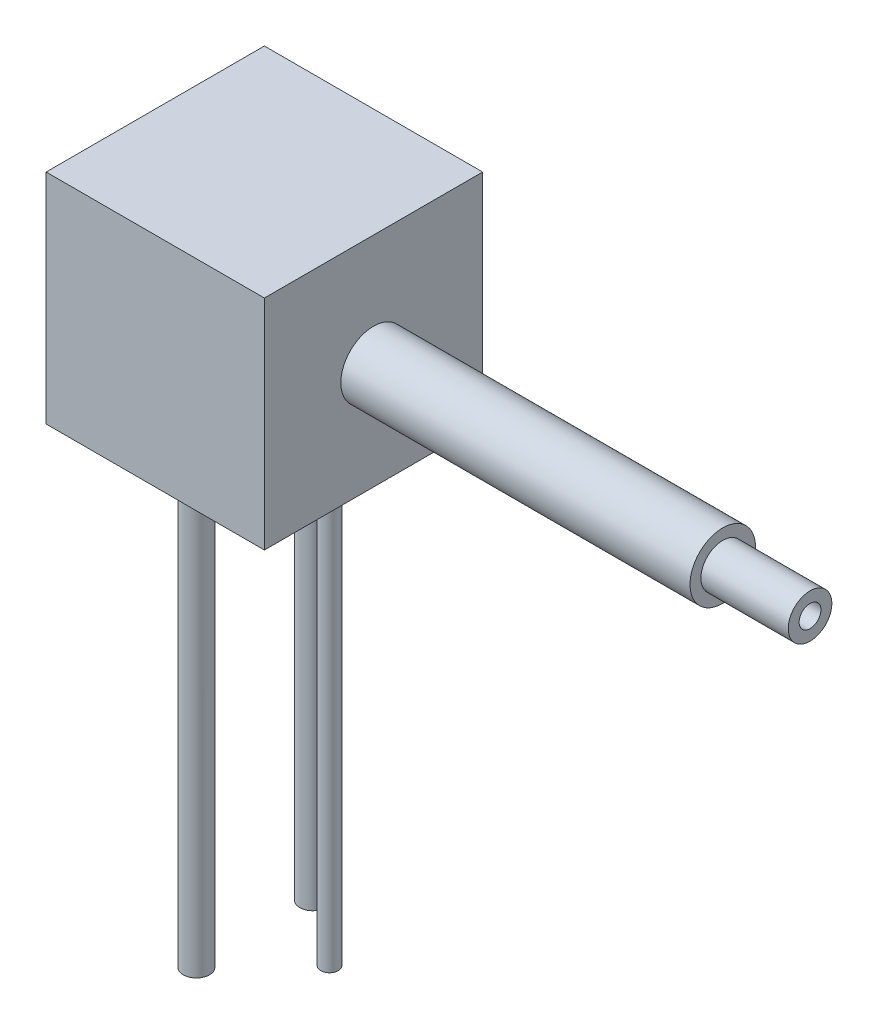
ISO-10303-21;
HEADER;
FILE_DESCRIPTION(('STEP AP214'),'2;1');
FILE_NAME('part.step','',(''),(''),'','','');
FILE_SCHEMA(('AUTOMOTIVE_DESIGN { 1 0 10303 214 1 1 1 1 }'));
ENDSEC;
DATA;
#1=APPLICATION_CONTEXT('core data for automotive mechanical design processes');
#2=APPLICATION_PROTOCOL_DEFINITION('international standard','automotive_design',2000,#1);
#3=PRODUCT_CONTEXT('',#1,'mechanical');
#4=PRODUCT('Part','Part','',(#3));
#5=PRODUCT_RELATED_PRODUCT_CATEGORY('part','',(#4));
#6=PRODUCT_DEFINITION_FORMATION('','',#4);
#7=PRODUCT_DEFINITION_CONTEXT('part definition',#1,'design');
#8=PRODUCT_DEFINITION('design','',#6,#7);
#9=PRODUCT_DEFINITION_SHAPE('','',#8);
#10=(LENGTH_UNIT() NAMED_UNIT(*) SI_UNIT(.MILLI.,.METRE.));
#11=(NAMED_UNIT(*) PLANE_ANGLE_UNIT() SI_UNIT($,.RADIAN.));
#12=(NAMED_UNIT(*) SI_UNIT($,.STERADIAN.) SOLID_ANGLE_UNIT());
#13=UNCERTAINTY_MEASURE_WITH_UNIT(LENGTH_MEASURE(1.E-05),#10,'distance_accuracy_value','');
#14=(GEOMETRIC_REPRESENTATION_CONTEXT(3) GLOBAL_UNCERTAINTY_ASSIGNED_CONTEXT((#13)) GLOBAL_UNIT_ASSIGNED_CONTEXT((#10,
#11,#12)) REPRESENTATION_CONTEXT('',''));
#15=CARTESIAN_POINT('',(0.,0.,0.));
#16=DIRECTION('',(0.,0.,1.));
#17=DIRECTION('',(1.,0.,0.));
#18=AXIS2_PLACEMENT_3D('',#15,#16,#17);
#19=CARTESIAN_POINT('',(250.,500.,-250.));
#20=DIRECTION('',(-1.,0.,0.));
#21=DIRECTION('',(0.,0.,1.));
#22=AXIS2_PLACEMENT_3D('',#19,#20,#21);
#23=PLANE('',#22);
#24=CARTESIAN_POINT('',(250.,244.080255807734,0.));
#25=DIRECTION('',(1.,0.,0.));
#26=DIRECTION('',(0.,0.,-1.));
#27=AXIS2_PLACEMENT_3D('',#24,#25,#26);
#28=CIRCLE('',#27,75.);
#29=CARTESIAN_POINT('',(250.,244.080255807734,-75.0000000000001));
#30=VERTEX_POINT('',#29);
#31=EDGE_CURVE('E42',#30,#30,#28,.T.);
#32=ORIENTED_EDGE('',*,*,#31,.F.);
#33=EDGE_LOOP('',(#32));
#34=FACE_BOUND('',#33,.T.);
#35=DIRECTION('',(0.,0.,-1.));
#36=VECTOR('',#35,1.);
#37=CARTESIAN_POINT('',(250.,0.,-250.));
#38=LINE('',#37,#36);
#39=CARTESIAN_POINT('',(250.,0.,250.));
#40=VERTEX_POINT('',#39);
#41=CARTESIAN_POINT('',(250.,0.,-250.));
#42=VERTEX_POINT('',#41);
#43=EDGE_CURVE('E102',#40,#42,#38,.T.);
#44=ORIENTED_EDGE('',*,*,#43,.T.);
#45=DIRECTION('',(0.,-1.,0.));
#46=VECTOR('',#45,1.);
#47=CARTESIAN_POINT('',(250.,500.,-250.));
#48=LINE('',#47,#46);
#49=CARTESIAN_POINT('',(250.,500.,-250.));
#50=VERTEX_POINT('',#49);
#51=EDGE_CURVE('E93',#50,#42,#48,.T.);
#52=ORIENTED_EDGE('',*,*,#51,.F.);
#53=DIRECTION('',(0.,0.,-1.));
#54=VECTOR('',#53,1.);
#55=CARTESIAN_POINT('',(250.,500.,-250.));
#56=LINE('',#55,#54);
#57=CARTESIAN_POINT('',(250.,500.,250.));
#58=VERTEX_POINT('',#57);
#59=EDGE_CURVE('E87',#58,#50,#56,.T.);
#60=ORIENTED_EDGE('',*,*,#59,.F.);
#61=DIRECTION('',(0.,-1.,0.));
#62=VECTOR('',#61,1.);
#63=CARTESIAN_POINT('',(250.,500.,250.));
#64=LINE('',#63,#62);
#65=EDGE_CURVE('E98',#58,#40,#64,.T.);
#66=ORIENTED_EDGE('',*,*,#65,.T.);
#67=EDGE_LOOP('',(#44,#52,#60,#66));
#68=FACE_BOUND('',#67,.T.);
#69=ADVANCED_FACE('F33',(#34,#68),#23,.F.);
#70=CARTESIAN_POINT('',(-250.,500.,-250.));
#71=DIRECTION('',(0.,0.,1.));
#72=DIRECTION('',(1.,0.,0.));
#73=AXIS2_PLACEMENT_3D('',#70,#71,#72);
#74=PLANE('',#73);
#75=DIRECTION('',(-1.,0.,0.));
#76=VECTOR('',#75,1.);
#77=CARTESIAN_POINT('',(-250.,0.,-250.));
#78=LINE('',#77,#76);
#79=CARTESIAN_POINT('',(-250.,0.,-250.));
#80=VERTEX_POINT('',#79);
#81=EDGE_CURVE('E92',#42,#80,#78,.T.);
#82=ORIENTED_EDGE('',*,*,#81,.T.);
#83=DIRECTION('',(0.,-1.,0.));
#84=VECTOR('',#83,1.);
#85=CARTESIAN_POINT('',(-250.,500.,-250.));
#86=LINE('',#85,#84);
#87=CARTESIAN_POINT('',(-250.,500.,-250.));
#88=VERTEX_POINT('',#87);
#89=EDGE_CURVE('E90',#88,#80,#86,.T.);
#90=ORIENTED_EDGE('',*,*,#89,.F.);
#91=DIRECTION('',(-1.,0.,0.));
#92=VECTOR('',#91,1.);
#93=CARTESIAN_POINT('',(-250.,500.,-250.));
#94=LINE('',#93,#92);
#95=EDGE_CURVE('E82',#50,#88,#94,.T.);
#96=ORIENTED_EDGE('',*,*,#95,.F.);
#97=ORIENTED_EDGE('',*,*,#51,.T.);
#98=EDGE_LOOP('',(#82,#90,#96,#97));
#99=FACE_BOUND('',#98,.T.);
#100=ADVANCED_FACE('F91',(#99),#74,.F.);
#101=CARTESIAN_POINT('',(-250.,500.,-250.));
#102=DIRECTION('',(1.,0.,0.));
#103=DIRECTION('',(0.,0.,-1.));
#104=AXIS2_PLACEMENT_3D('',#101,#102,#103);
#105=PLANE('',#104);
#106=DIRECTION('',(0.,0.,1.));
#107=VECTOR('',#106,1.);
#108=CARTESIAN_POINT('',(-250.,0.,-250.));
#109=LINE('',#108,#107);
#110=CARTESIAN_POINT('',(-250.,0.,250.));
#111=VERTEX_POINT('',#110);
#112=EDGE_CURVE('E68',#80,#111,#109,.T.);
#113=ORIENTED_EDGE('',*,*,#112,.T.);
#114=DIRECTION('',(0.,-1.,0.));
#115=VECTOR('',#114,1.);
#116=CARTESIAN_POINT('',(-250.,500.,250.));
#117=LINE('',#116,#115);
#118=CARTESIAN_POINT('',(-250.,500.,250.));
#119=VERTEX_POINT('',#118);
#120=EDGE_CURVE('E94',#119,#111,#117,.T.);
#121=ORIENTED_EDGE('',*,*,#120,.F.);
#122=DIRECTION('',(0.,0.,1.));
#123=VECTOR('',#122,1.);
#124=CARTESIAN_POINT('',(-250.,500.,-250.));
#125=LINE('',#124,#123);
#126=EDGE_CURVE('E85',#88,#119,#125,.T.);
#127=ORIENTED_EDGE('',*,*,#126,.F.);
#128=ORIENTED_EDGE('',*,*,#89,.T.);
#129=EDGE_LOOP('',(#113,#121,#127,#128));
#130=FACE_BOUND('',#129,.T.);
#131=ADVANCED_FACE('F96',(#130),#105,.F.);
#132=CARTESIAN_POINT('',(-250.,500.,250.));
#133=DIRECTION('',(0.,0.,-1.));
#134=DIRECTION('',(-1.,0.,0.));
#135=AXIS2_PLACEMENT_3D('',#132,#133,#134);
#136=PLANE('',#135);
#137=DIRECTION('',(1.,0.,0.));
#138=VECTOR('',#137,1.);
#139=CARTESIAN_POINT('',(-250.,0.,250.));
#140=LINE('',#139,#138);
#141=EDGE_CURVE('E74',#111,#40,#140,.T.);
#142=ORIENTED_EDGE('',*,*,#141,.T.);
#143=ORIENTED_EDGE('',*,*,#65,.F.);
#144=DIRECTION('',(1.,0.,0.));
#145=VECTOR('',#144,1.);
#146=CARTESIAN_POINT('',(-250.,500.,250.));
#147=LINE('',#146,#145);
#148=EDGE_CURVE('E51',#119,#58,#147,.T.);
#149=ORIENTED_EDGE('',*,*,#148,.F.);
#150=ORIENTED_EDGE('',*,*,#120,.T.);
#151=EDGE_LOOP('',(#142,#143,#149,#150));
#152=FACE_BOUND('',#151,.T.);
#153=ADVANCED_FACE('F158',(#152),#136,.F.);
#154=CARTESIAN_POINT('',(0.,500.,0.));
#155=DIRECTION('',(0.,1.,0.));
#156=DIRECTION('',(0.,0.,1.));
#157=AXIS2_PLACEMENT_3D('',#154,#155,#156);
#158=PLANE('',#157);
#159=ORIENTED_EDGE('',*,*,#59,.T.);
#160=ORIENTED_EDGE('',*,*,#95,.T.);
#161=ORIENTED_EDGE('',*,*,#126,.T.);
#162=ORIENTED_EDGE('',*,*,#148,.T.);
#163=EDGE_LOOP('',(#159,#160,#161,#162));
#164=FACE_BOUND('',#163,.T.);
#165=ADVANCED_FACE('F83',(#164),#158,.T.);
#166=CARTESIAN_POINT('',(0.,0.,0.));
#167=DIRECTION('',(0.,1.,0.));
#168=DIRECTION('',(0.,0.,1.));
#169=AXIS2_PLACEMENT_3D('',#166,#167,#168);
#170=PLANE('',#169);
#171=CARTESIAN_POINT('',(0.,0.,-111.056313587958));
#172=DIRECTION('',(0.,1.,0.));
#173=DIRECTION('',(0.,0.,1.));
#174=AXIS2_PLACEMENT_3D('',#171,#172,#173);
#175=CIRCLE('',#174,30.);
#176=CARTESIAN_POINT('',(0.,0.,-81.0563135879577));
#177=VERTEX_POINT('',#176);
#178=EDGE_CURVE('E36',#177,#177,#175,.F.);
#179=ORIENTED_EDGE('',*,*,#178,.F.);
#180=EDGE_LOOP('',(#179));
#181=FACE_BOUND('',#180,.T.);
#182=CARTESIAN_POINT('',(149.221176771437,0.,0.));
#183=DIRECTION('',(0.,1.,0.));
#184=DIRECTION('',(0.,0.,1.));
#185=AXIS2_PLACEMENT_3D('',#182,#183,#184);
#186=CIRCLE('',#185,20.);
#187=CARTESIAN_POINT('',(149.221176771437,0.,20.));
#188=VERTEX_POINT('',#187);
#189=EDGE_CURVE('E117',#188,#188,#186,.F.);
#190=ORIENTED_EDGE('',*,*,#189,.F.);
#191=EDGE_LOOP('',(#190));
#192=FACE_BOUND('',#191,.T.);
#193=CARTESIAN_POINT('',(-149.221176771437,0.,0.));
#194=DIRECTION('',(0.,1.,0.));
#195=DIRECTION('',(0.,0.,1.));
#196=AXIS2_PLACEMENT_3D('',#193,#194,#195);
#197=CIRCLE('',#196,20.);
#198=CARTESIAN_POINT('',(-149.221176771437,0.,20.));
#199=VERTEX_POINT('',#198);
#200=EDGE_CURVE('E115',#199,#199,#197,.F.);
#201=ORIENTED_EDGE('',*,*,#200,.F.);
#202=EDGE_LOOP('',(#201));
#203=FACE_BOUND('',#202,.T.);
#204=CARTESIAN_POINT('',(0.,0.,155.753901100142));
#205=DIRECTION('',(0.,1.,0.));
#206=DIRECTION('',(0.,0.,1.));
#207=AXIS2_PLACEMENT_3D('',#204,#205,#206);
#208=CIRCLE('',#207,30.);
#209=CARTESIAN_POINT('',(0.,0.,185.753901100142));
#210=VERTEX_POINT('',#209);
#211=EDGE_CURVE('E112',#210,#210,#208,.F.);
#212=ORIENTED_EDGE('',*,*,#211,.F.);
#213=EDGE_LOOP('',(#212));
#214=FACE_BOUND('',#213,.T.);
#215=ORIENTED_EDGE('',*,*,#43,.F.);
#216=ORIENTED_EDGE('',*,*,#141,.F.);
#217=ORIENTED_EDGE('',*,*,#112,.F.);
#218=ORIENTED_EDGE('',*,*,#81,.F.);
#219=EDGE_LOOP('',(#215,#216,#217,#218));
#220=FACE_BOUND('',#219,.T.);
#221=ADVANCED_FACE('F148',(#181,#192,#203,#214,#220),#170,.F.);
#222=CARTESIAN_POINT('',(0.,-1000.,155.753901100142));
#223=DIRECTION('',(0.,1.,0.));
#224=DIRECTION('',(0.,0.,1.));
#225=AXIS2_PLACEMENT_3D('',#222,#223,#224);
#226=CYLINDRICAL_SURFACE('',#225,30.);
#227=CARTESIAN_POINT('',(0.,-1000.,155.753901100142));
#228=DIRECTION('',(0.,-1.,0.));
#229=DIRECTION('',(0.,0.,-1.));
#230=AXIS2_PLACEMENT_3D('',#227,#228,#229);
#231=CIRCLE('',#230,30.);
#232=CARTESIAN_POINT('',(0.,-1000.,125.753901100142));
#233=VERTEX_POINT('',#232);
#234=EDGE_CURVE('E105',#233,#233,#231,.T.);
#235=ORIENTED_EDGE('',*,*,#234,.F.);
#236=EDGE_LOOP('',(#235));
#237=FACE_BOUND('',#236,.T.);
#238=ORIENTED_EDGE('',*,*,#211,.T.);
#239=EDGE_LOOP('',(#238));
#240=FACE_BOUND('',#239,.T.);
#241=ADVANCED_FACE('F145',(#237,#240),#226,.T.);
#242=CARTESIAN_POINT('',(0.,-1000.,155.753901100142));
#243=DIRECTION('',(0.,-1.,0.));
#244=DIRECTION('',(0.,0.,-1.));
#245=AXIS2_PLACEMENT_3D('',#242,#243,#244);
#246=PLANE('',#245);
#247=CARTESIAN_POINT('',(0.,-1000.,155.753901100142));
#248=DIRECTION('',(0.,-1.,0.));
#249=DIRECTION('',(0.,0.,-1.));
#250=AXIS2_PLACEMENT_3D('',#247,#248,#249);
#251=CIRCLE('',#250,15.);
#252=CARTESIAN_POINT('',(0.,-1000.,140.753901100142));
#253=VERTEX_POINT('',#252);
#254=EDGE_CURVE('E421',#253,#253,#251,.T.);
#255=ORIENTED_EDGE('',*,*,#254,.F.);
#256=EDGE_LOOP('',(#255));
#257=FACE_BOUND('',#256,.T.);
#258=ORIENTED_EDGE('',*,*,#234,.T.);
#259=EDGE_LOOP('',(#258));
#260=FACE_BOUND('',#259,.T.);
#261=ADVANCED_FACE('F143',(#257,#260),#246,.T.);
#262=CARTESIAN_POINT('',(-149.221176771437,-1000.,0.));
#263=DIRECTION('',(0.,1.,0.));
#264=DIRECTION('',(0.,0.,1.));
#265=AXIS2_PLACEMENT_3D('',#262,#263,#264);
#266=CYLINDRICAL_SURFACE('',#265,20.);
#267=CARTESIAN_POINT('',(-149.221176771437,-1000.,0.));
#268=DIRECTION('',(0.,-1.,0.));
#269=DIRECTION('',(0.,0.,-1.));
#270=AXIS2_PLACEMENT_3D('',#267,#268,#269);
#271=CIRCLE('',#270,20.);
#272=CARTESIAN_POINT('',(-149.221176771437,-1000.,-20.));
#273=VERTEX_POINT('',#272);
#274=EDGE_CURVE('E137',#273,#273,#271,.T.);
#275=ORIENTED_EDGE('',*,*,#274,.F.);
#276=EDGE_LOOP('',(#275));
#277=FACE_BOUND('',#276,.T.);
#278=ORIENTED_EDGE('',*,*,#200,.T.);
#279=EDGE_LOOP('',(#278));
#280=FACE_BOUND('',#279,.T.);
#281=ADVANCED_FACE('F207',(#277,#280),#266,.T.);
#282=CARTESIAN_POINT('',(-149.221176771437,-1000.,0.));
#283=DIRECTION('',(0.,-1.,0.));
#284=DIRECTION('',(0.,0.,-1.));
#285=AXIS2_PLACEMENT_3D('',#282,#283,#284);
#286=PLANE('',#285);
#287=CARTESIAN_POINT('',(-149.221176771437,-1000.,0.));
#288=DIRECTION('',(0.,-1.,0.));
#289=DIRECTION('',(0.,0.,-1.));
#290=AXIS2_PLACEMENT_3D('',#287,#288,#289);
#291=CIRCLE('',#290,10.);
#292=CARTESIAN_POINT('',(-149.221176771437,-1000.,-10.));
#293=VERTEX_POINT('',#292);
#294=EDGE_CURVE('E444',#293,#293,#291,.T.);
#295=ORIENTED_EDGE('',*,*,#294,.F.);
#296=EDGE_LOOP('',(#295));
#297=FACE_BOUND('',#296,.T.);
#298=ORIENTED_EDGE('',*,*,#274,.T.);
#299=EDGE_LOOP('',(#298));
#300=FACE_BOUND('',#299,.T.);
#301=ADVANCED_FACE('F212',(#297,#300),#286,.T.);
#302=CARTESIAN_POINT('',(149.221176771437,-1000.,0.));
#303=DIRECTION('',(0.,1.,0.));
#304=DIRECTION('',(0.,0.,1.));
#305=AXIS2_PLACEMENT_3D('',#302,#303,#304);
#306=CYLINDRICAL_SURFACE('',#305,20.);
#307=CARTESIAN_POINT('',(149.221176771437,-1000.,0.));
#308=DIRECTION('',(0.,-1.,0.));
#309=DIRECTION('',(0.,0.,-1.));
#310=AXIS2_PLACEMENT_3D('',#307,#308,#309);
#311=CIRCLE('',#310,20.);
#312=CARTESIAN_POINT('',(149.221176771437,-1000.,-20.));
#313=VERTEX_POINT('',#312);
#314=EDGE_CURVE('E134',#313,#313,#311,.T.);
#315=ORIENTED_EDGE('',*,*,#314,.F.);
#316=EDGE_LOOP('',(#315));
#317=FACE_BOUND('',#316,.T.);
#318=ORIENTED_EDGE('',*,*,#189,.T.);
#319=EDGE_LOOP('',(#318));
#320=FACE_BOUND('',#319,.T.);
#321=ADVANCED_FACE('F220',(#317,#320),#306,.T.);
#322=CARTESIAN_POINT('',(149.221176771437,-1000.,0.));
#323=DIRECTION('',(0.,-1.,0.));
#324=DIRECTION('',(0.,0.,-1.));
#325=AXIS2_PLACEMENT_3D('',#322,#323,#324);
#326=PLANE('',#325);
#327=CARTESIAN_POINT('',(149.221176771437,-1000.,0.));
#328=DIRECTION('',(0.,-1.,0.));
#329=DIRECTION('',(0.,0.,-1.));
#330=AXIS2_PLACEMENT_3D('',#327,#328,#329);
#331=CIRCLE('',#330,10.);
#332=CARTESIAN_POINT('',(149.221176771437,-1000.,-10.));
#333=VERTEX_POINT('',#332);
#334=EDGE_CURVE('E432',#333,#333,#331,.T.);
#335=ORIENTED_EDGE('',*,*,#334,.F.);
#336=EDGE_LOOP('',(#335));
#337=FACE_BOUND('',#336,.T.);
#338=ORIENTED_EDGE('',*,*,#314,.T.);
#339=EDGE_LOOP('',(#338));
#340=FACE_BOUND('',#339,.T.);
#341=ADVANCED_FACE('F225',(#337,#340),#326,.T.);
#342=CARTESIAN_POINT('',(0.,-1000.,-111.056313587958));
#343=DIRECTION('',(0.,1.,0.));
#344=DIRECTION('',(0.,0.,1.));
#345=AXIS2_PLACEMENT_3D('',#342,#343,#344);
#346=CYLINDRICAL_SURFACE('',#345,30.);
#347=CARTESIAN_POINT('',(0.,-1000.,-111.056313587958));
#348=DIRECTION('',(0.,-1.,0.));
#349=DIRECTION('',(0.,0.,-1.));
#350=AXIS2_PLACEMENT_3D('',#347,#348,#349);
#351=CIRCLE('',#350,30.);
#352=CARTESIAN_POINT('',(0.,-1000.,-141.056313587958));
#353=VERTEX_POINT('',#352);
#354=EDGE_CURVE('E131',#353,#353,#351,.T.);
#355=ORIENTED_EDGE('',*,*,#354,.F.);
#356=EDGE_LOOP('',(#355));
#357=FACE_BOUND('',#356,.T.);
#358=ORIENTED_EDGE('',*,*,#178,.T.);
#359=EDGE_LOOP('',(#358));
#360=FACE_BOUND('',#359,.T.);
#361=ADVANCED_FACE('F233',(#357,#360),#346,.T.);
#362=CARTESIAN_POINT('',(0.,-1000.,-111.056313587958));
#363=DIRECTION('',(0.,-1.,0.));
#364=DIRECTION('',(0.,0.,-1.));
#365=AXIS2_PLACEMENT_3D('',#362,#363,#364);
#366=PLANE('',#365);
#367=CARTESIAN_POINT('',(0.,-1000.,-111.056313587958));
#368=DIRECTION('',(0.,-1.,0.));
#369=DIRECTION('',(0.,0.,-1.));
#370=AXIS2_PLACEMENT_3D('',#367,#368,#369);
#371=CIRCLE('',#370,15.);
#372=CARTESIAN_POINT('',(0.,-1000.,-126.056313587958));
#373=VERTEX_POINT('',#372);
#374=EDGE_CURVE('E438',#373,#373,#371,.T.);
#375=ORIENTED_EDGE('',*,*,#374,.F.);
#376=EDGE_LOOP('',(#375));
#377=FACE_BOUND('',#376,.T.);
#378=ORIENTED_EDGE('',*,*,#354,.T.);
#379=EDGE_LOOP('',(#378));
#380=FACE_BOUND('',#379,.T.);
#381=ADVANCED_FACE('F237',(#377,#380),#366,.T.);
#382=CARTESIAN_POINT('',(1050.,244.080255807734,-2.33146835171283E-13));
#383=DIRECTION('',(-1.,0.,0.));
#384=DIRECTION('',(0.,0.,1.));
#385=AXIS2_PLACEMENT_3D('',#382,#383,#384);
#386=CYLINDRICAL_SURFACE('',#385,75.);
#387=CARTESIAN_POINT('',(1050.,244.080255807734,-2.33146835171283E-13));
#388=DIRECTION('',(1.,0.,0.));
#389=DIRECTION('',(0.,0.,-1.));
#390=AXIS2_PLACEMENT_3D('',#387,#388,#389);
#391=CIRCLE('',#390,75.);
#392=CARTESIAN_POINT('',(1050.,244.080255807734,-75.0000000000002));
#393=VERTEX_POINT('',#392);
#394=EDGE_CURVE('E130',#393,#393,#391,.T.);
#395=ORIENTED_EDGE('',*,*,#394,.F.);
#396=EDGE_LOOP('',(#395));
#397=FACE_BOUND('',#396,.T.);
#398=ORIENTED_EDGE('',*,*,#31,.T.);
#399=EDGE_LOOP('',(#398));
#400=FACE_BOUND('',#399,.T.);
#401=ADVANCED_FACE('F250',(#397,#400),#386,.T.);
#402=CARTESIAN_POINT('',(1050.,244.080255807734,-2.33146835171283E-13));
#403=DIRECTION('',(1.,0.,0.));
#404=DIRECTION('',(0.,0.,-1.));
#405=AXIS2_PLACEMENT_3D('',#402,#403,#404);
#406=PLANE('',#405);
#407=CARTESIAN_POINT('',(1050.,244.080255807734,-2.33146835171283E-13));
#408=DIRECTION('',(1.,0.,0.));
#409=DIRECTION('',(0.,0.,-1.));
#410=AXIS2_PLACEMENT_3D('',#407,#408,#409);
#411=CIRCLE('',#410,50.);
#412=CARTESIAN_POINT('',(1050.,244.080255807734,-50.0000000000003));
#413=VERTEX_POINT('',#412);
#414=EDGE_CURVE('E11',#413,#413,#411,.T.);
#415=ORIENTED_EDGE('',*,*,#414,.F.);
#416=EDGE_LOOP('',(#415));
#417=FACE_BOUND('',#416,.T.);
#418=ORIENTED_EDGE('',*,*,#394,.T.);
#419=EDGE_LOOP('',(#418));
#420=FACE_BOUND('',#419,.T.);
#421=ADVANCED_FACE('F255',(#417,#420),#406,.T.);
#422=CARTESIAN_POINT('',(1250.,244.080255807734,-2.77555756156289E-13));
#423=DIRECTION('',(-1.,0.,0.));
#424=DIRECTION('',(0.,0.,1.));
#425=AXIS2_PLACEMENT_3D('',#422,#423,#424);
#426=CYLINDRICAL_SURFACE('',#425,50.);
#427=CARTESIAN_POINT('',(1250.,244.080255807734,-2.77555756156289E-13));
#428=DIRECTION('',(1.,0.,0.));
#429=DIRECTION('',(0.,0.,-1.));
#430=AXIS2_PLACEMENT_3D('',#427,#428,#429);
#431=CIRCLE('',#430,50.);
#432=CARTESIAN_POINT('',(1250.,244.080255807734,-50.0000000000003));
#433=VERTEX_POINT('',#432);
#434=EDGE_CURVE('E448',#433,#433,#431,.T.);
#435=ORIENTED_EDGE('',*,*,#434,.F.);
#436=EDGE_LOOP('',(#435));
#437=FACE_BOUND('',#436,.T.);
#438=ORIENTED_EDGE('',*,*,#414,.T.);
#439=EDGE_LOOP('',(#438));
#440=FACE_BOUND('',#439,.T.);
#441=ADVANCED_FACE('F265',(#437,#440),#426,.T.);
#442=CARTESIAN_POINT('',(1250.,244.080255807734,-2.77555756156289E-13));
#443=DIRECTION('',(1.,0.,0.));
#444=DIRECTION('',(0.,0.,-1.));
#445=AXIS2_PLACEMENT_3D('',#442,#443,#444);
#446=PLANE('',#445);
#447=CARTESIAN_POINT('',(1250.,244.080255807734,-2.77555756156289E-13));
#448=DIRECTION('',(1.,0.,0.));
#449=DIRECTION('',(0.,0.,-1.));
#450=AXIS2_PLACEMENT_3D('',#447,#448,#449);
#451=CIRCLE('',#450,25.);
#452=CARTESIAN_POINT('',(1250.,244.080255807734,-25.0000000000003));
#453=VERTEX_POINT('',#452);
#454=EDGE_CURVE('E420',#453,#453,#451,.T.);
#455=ORIENTED_EDGE('',*,*,#454,.F.);
#456=EDGE_LOOP('',(#455));
#457=FACE_BOUND('',#456,.T.);
#458=ORIENTED_EDGE('',*,*,#434,.T.);
#459=EDGE_LOOP('',(#458));
#460=FACE_BOUND('',#459,.T.);
#461=ADVANCED_FACE('F275',(#457,#460),#446,.T.);
#462=CARTESIAN_POINT('',(50.,244.080255807734,0.));
#463=DIRECTION('',(1.,0.,0.));
#464=DIRECTION('',(0.,0.,-1.));
#465=AXIS2_PLACEMENT_3D('',#462,#463,#464);
#466=CYLINDRICAL_SURFACE('',#465,25.);
#467=CARTESIAN_POINT('',(50.,244.080255807734,0.));
#468=DIRECTION('',(1.,0.,0.));
#469=DIRECTION('',(0.,0.,-1.));
#470=AXIS2_PLACEMENT_3D('',#467,#468,#469);
#471=CIRCLE('',#470,25.);
#472=CARTESIAN_POINT('',(50.,244.080255807734,-25.));
#473=VERTEX_POINT('',#472);
#474=EDGE_CURVE('E424',#473,#473,#471,.T.);
#475=ORIENTED_EDGE('',*,*,#474,.F.);
#476=EDGE_LOOP('',(#475));
#477=FACE_BOUND('',#476,.T.);
#478=ORIENTED_EDGE('',*,*,#454,.T.);
#479=EDGE_LOOP('',(#478));
#480=FACE_BOUND('',#479,.T.);
#481=ADVANCED_FACE('F285',(#477,#480),#466,.F.);
#482=CARTESIAN_POINT('',(50.,244.080255807734,0.));
#483=DIRECTION('',(1.,0.,0.));
#484=DIRECTION('',(0.,0.,-1.));
#485=AXIS2_PLACEMENT_3D('',#482,#483,#484);
#486=PLANE('',#485);
#487=ORIENTED_EDGE('',*,*,#474,.T.);
#488=EDGE_LOOP('',(#487));
#489=FACE_BOUND('',#488,.T.);
#490=ADVANCED_FACE('F295',(#489),#486,.T.);
#491=CARTESIAN_POINT('',(0.,-800.,-111.056313587958));
#492=DIRECTION('',(0.,-1.,0.));
#493=DIRECTION('',(0.,0.,-1.));
#494=AXIS2_PLACEMENT_3D('',#491,#492,#493);
#495=CYLINDRICAL_SURFACE('',#494,15.);
#496=CARTESIAN_POINT('',(0.,-800.,-111.056313587958));
#497=DIRECTION('',(0.,-1.,0.));
#498=DIRECTION('',(0.,0.,-1.));
#499=AXIS2_PLACEMENT_3D('',#496,#497,#498);
#500=CIRCLE('',#499,15.);
#501=CARTESIAN_POINT('',(0.,-800.,-126.056313587958));
#502=VERTEX_POINT('',#501);
#503=EDGE_CURVE('E435',#502,#502,#500,.T.);
#504=ORIENTED_EDGE('',*,*,#503,.F.);
#505=EDGE_LOOP('',(#504));
#506=FACE_BOUND('',#505,.T.);
#507=ORIENTED_EDGE('',*,*,#374,.T.);
#508=EDGE_LOOP('',(#507));
#509=FACE_BOUND('',#508,.T.);
#510=ADVANCED_FACE('F305',(#506,#509),#495,.F.);
#511=CARTESIAN_POINT('',(0.,-800.,-111.056313587958));
#512=DIRECTION('',(0.,-1.,0.));
#513=DIRECTION('',(0.,0.,-1.));
#514=AXIS2_PLACEMENT_3D('',#511,#512,#513);
#515=PLANE('',#514);
#516=ORIENTED_EDGE('',*,*,#503,.T.);
#517=EDGE_LOOP('',(#516));
#518=FACE_BOUND('',#517,.T.);
#519=ADVANCED_FACE('F343',(#518),#515,.T.);
#520=CARTESIAN_POINT('',(149.221176771437,-800.,0.));
#521=DIRECTION('',(0.,-1.,0.));
#522=DIRECTION('',(0.,0.,-1.));
#523=AXIS2_PLACEMENT_3D('',#520,#521,#522);
#524=CYLINDRICAL_SURFACE('',#523,10.);
#525=CARTESIAN_POINT('',(149.221176771437,-800.,0.));
#526=DIRECTION('',(0.,-1.,0.));
#527=DIRECTION('',(0.,0.,-1.));
#528=AXIS2_PLACEMENT_3D('',#525,#526,#527);
#529=CIRCLE('',#528,10.);
#530=CARTESIAN_POINT('',(149.221176771437,-800.,-10.));
#531=VERTEX_POINT('',#530);
#532=EDGE_CURVE('E427',#531,#531,#529,.T.);
#533=ORIENTED_EDGE('',*,*,#532,.F.);
#534=EDGE_LOOP('',(#533));
#535=FACE_BOUND('',#534,.T.);
#536=ORIENTED_EDGE('',*,*,#334,.T.);
#537=EDGE_LOOP('',(#536));
#538=FACE_BOUND('',#537,.T.);
#539=ADVANCED_FACE('F353',(#535,#538),#524,.F.);
#540=CARTESIAN_POINT('',(149.221176771437,-800.,0.));
#541=DIRECTION('',(0.,-1.,0.));
#542=DIRECTION('',(0.,0.,-1.));
#543=AXIS2_PLACEMENT_3D('',#540,#541,#542);
#544=PLANE('',#543);
#545=ORIENTED_EDGE('',*,*,#532,.T.);
#546=EDGE_LOOP('',(#545));
#547=FACE_BOUND('',#546,.T.);
#548=ADVANCED_FACE('F363',(#547),#544,.T.);
#549=CARTESIAN_POINT('',(-149.221176771437,-800.,0.));
#550=DIRECTION('',(0.,-1.,0.));
#551=DIRECTION('',(0.,0.,-1.));
#552=AXIS2_PLACEMENT_3D('',#549,#550,#551);
#553=CYLINDRICAL_SURFACE('',#552,10.);
#554=CARTESIAN_POINT('',(-149.221176771437,-800.,0.));
#555=DIRECTION('',(0.,-1.,0.));
#556=DIRECTION('',(0.,0.,-1.));
#557=AXIS2_PLACEMENT_3D('',#554,#555,#556);
#558=CIRCLE('',#557,10.);
#559=CARTESIAN_POINT('',(-149.221176771437,-800.,-10.));
#560=VERTEX_POINT('',#559);
#561=EDGE_CURVE('E441',#560,#560,#558,.T.);
#562=ORIENTED_EDGE('',*,*,#561,.F.);
#563=EDGE_LOOP('',(#562));
#564=FACE_BOUND('',#563,.T.);
#565=ORIENTED_EDGE('',*,*,#294,.T.);
#566=EDGE_LOOP('',(#565));
#567=FACE_BOUND('',#566,.T.);
#568=ADVANCED_FACE('F373',(#564,#567),#553,.F.);
#569=CARTESIAN_POINT('',(-149.221176771437,-800.,0.));
#570=DIRECTION('',(0.,-1.,0.));
#571=DIRECTION('',(0.,0.,-1.));
#572=AXIS2_PLACEMENT_3D('',#569,#570,#571);
#573=PLANE('',#572);
#574=ORIENTED_EDGE('',*,*,#561,.T.);
#575=EDGE_LOOP('',(#574));
#576=FACE_BOUND('',#575,.T.);
#577=ADVANCED_FACE('F383',(#576),#573,.T.);
#578=CARTESIAN_POINT('',(0.,-800.,155.753901100142));
#579=DIRECTION('',(0.,-1.,0.));
#580=DIRECTION('',(0.,0.,-1.));
#581=AXIS2_PLACEMENT_3D('',#578,#579,#580);
#582=CYLINDRICAL_SURFACE('',#581,15.);
#583=CARTESIAN_POINT('',(0.,-800.,155.753901100142));
#584=DIRECTION('',(0.,-1.,0.));
#585=DIRECTION('',(0.,0.,-1.));
#586=AXIS2_PLACEMENT_3D('',#583,#584,#585);
#587=CIRCLE('',#586,15.);
#588=CARTESIAN_POINT('',(0.,-800.,140.753901100142));
#589=VERTEX_POINT('',#588);
#590=EDGE_CURVE('E419',#589,#589,#587,.T.);
#591=ORIENTED_EDGE('',*,*,#590,.F.);
#592=EDGE_LOOP('',(#591));
#593=FACE_BOUND('',#592,.T.);
#594=ORIENTED_EDGE('',*,*,#254,.T.);
#595=EDGE_LOOP('',(#594));
#596=FACE_BOUND('',#595,.T.);
#597=ADVANCED_FACE('F393',(#593,#596),#582,.F.);
#598=CARTESIAN_POINT('',(0.,-800.,155.753901100142));
#599=DIRECTION('',(0.,-1.,0.));
#600=DIRECTION('',(0.,0.,-1.));
#601=AXIS2_PLACEMENT_3D('',#598,#599,#600);
#602=PLANE('',#601);
#603=ORIENTED_EDGE('',*,*,#590,.T.);
#604=EDGE_LOOP('',(#603));
#605=FACE_BOUND('',#604,.T.);
#606=ADVANCED_FACE('F403',(#605),#602,.T.);
#607=CLOSED_SHELL('',(#69,#100,#131,#153,#165,#221,#241,#261,#281,#301,#321,#341,#361,#381,#401,
#421,#441,#461,#481,#490,#510,#519,#539,#548,#568,#577,#597,#606));
#608=MANIFOLD_SOLID_BREP('B2',#607);
#609=ADVANCED_BREP_SHAPE_REPRESENTATION('',(#18,#608),#14);
#610=SHAPE_DEFINITION_REPRESENTATION(#9,#609);
ENDSEC;
END-ISO-10303-21;
